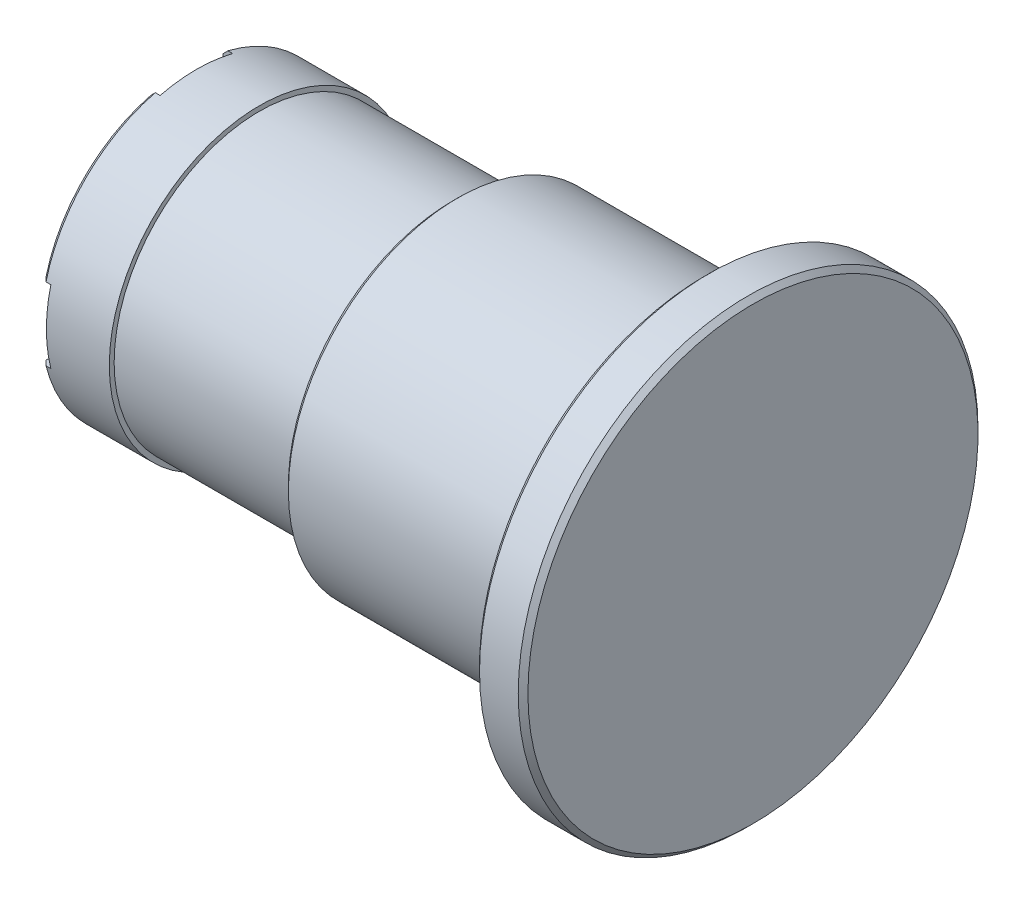
ISO-10303-21;
HEADER;
FILE_DESCRIPTION(('STEP AP214'),'2;1');
FILE_NAME('part.step','',(''),(''),'','','');
FILE_SCHEMA(('AUTOMOTIVE_DESIGN { 1 0 10303 214 1 1 1 1 }'));
ENDSEC;
DATA;
#1=APPLICATION_CONTEXT('core data for automotive mechanical design processes');
#2=APPLICATION_PROTOCOL_DEFINITION('international standard','automotive_design',2000,#1);
#3=PRODUCT_CONTEXT('',#1,'mechanical');
#4=PRODUCT('Part','Part','',(#3));
#5=PRODUCT_RELATED_PRODUCT_CATEGORY('part','',(#4));
#6=PRODUCT_DEFINITION_FORMATION('','',#4);
#7=PRODUCT_DEFINITION_CONTEXT('part definition',#1,'design');
#8=PRODUCT_DEFINITION('design','',#6,#7);
#9=PRODUCT_DEFINITION_SHAPE('','',#8);
#10=(LENGTH_UNIT() NAMED_UNIT(*) SI_UNIT(.MILLI.,.METRE.));
#11=(NAMED_UNIT(*) PLANE_ANGLE_UNIT() SI_UNIT($,.RADIAN.));
#12=(NAMED_UNIT(*) SI_UNIT($,.STERADIAN.) SOLID_ANGLE_UNIT());
#13=UNCERTAINTY_MEASURE_WITH_UNIT(LENGTH_MEASURE(1.E-05),#10,'distance_accuracy_value','');
#14=(GEOMETRIC_REPRESENTATION_CONTEXT(3) GLOBAL_UNCERTAINTY_ASSIGNED_CONTEXT((#13)) GLOBAL_UNIT_ASSIGNED_CONTEXT((#10,
#11,#12)) REPRESENTATION_CONTEXT('',''));
#15=CARTESIAN_POINT('',(0.,0.,0.));
#16=DIRECTION('',(0.,0.,1.));
#17=DIRECTION('',(1.,0.,0.));
#18=AXIS2_PLACEMENT_3D('',#15,#16,#17);
#19=CARTESIAN_POINT('',(10.,3.1,0.));
#20=DIRECTION('',(1.,0.,0.));
#21=DIRECTION('',(0.,0.,-1.));
#22=AXIS2_PLACEMENT_3D('',#19,#20,#21);
#23=PLANE('',#22);
#24=CARTESIAN_POINT('',(10.,0.,0.));
#25=DIRECTION('',(1.,0.,0.));
#26=DIRECTION('',(0.,0.,-1.));
#27=AXIS2_PLACEMENT_3D('',#24,#25,#26);
#28=CIRCLE('',#27,3.);
#29=CARTESIAN_POINT('',(10.,-2.90473750965556,0.750000000000001));
#30=VERTEX_POINT('',#29);
#31=CARTESIAN_POINT('',(10.,-0.75,2.90473750965556));
#32=VERTEX_POINT('',#31);
#33=EDGE_CURVE('E264',#30,#32,#28,.F.);
#34=ORIENTED_EDGE('',*,*,#33,.T.);
#35=DIRECTION('',(0.,0.,1.));
#36=VECTOR('',#35,1.);
#37=CARTESIAN_POINT('',(10.,-0.75,3.1));
#38=LINE('',#37,#36);
#39=CARTESIAN_POINT('',(10.,-0.749999999999999,0.750000000000004));
#40=VERTEX_POINT('',#39);
#41=EDGE_CURVE('E181',#40,#32,#38,.T.);
#42=ORIENTED_EDGE('',*,*,#41,.F.);
#43=DIRECTION('',(0.,1.,0.));
#44=VECTOR('',#43,1.);
#45=CARTESIAN_POINT('',(10.,-3.1,0.75));
#46=LINE('',#45,#44);
#47=EDGE_CURVE('E179',#30,#40,#46,.T.);
#48=ORIENTED_EDGE('',*,*,#47,.F.);
#49=EDGE_LOOP('',(#34,#42,#48));
#50=FACE_BOUND('',#49,.T.);
#51=ADVANCED_FACE('F33',(#50),#23,.F.);
#52=CARTESIAN_POINT('',(10.,-0.750000000000001,-2.90473750965556));
#53=VERTEX_POINT('',#52);
#54=CARTESIAN_POINT('',(10.,-2.90473750965556,-0.75));
#55=VERTEX_POINT('',#54);
#56=EDGE_CURVE('E260',#53,#55,#28,.F.);
#57=ORIENTED_EDGE('',*,*,#56,.T.);
#58=DIRECTION('',(0.,-1.,0.));
#59=VECTOR('',#58,1.);
#60=CARTESIAN_POINT('',(10.,-3.1,-0.75));
#61=LINE('',#60,#59);
#62=CARTESIAN_POINT('',(10.,-0.749999999999999,-0.750000000000004));
#63=VERTEX_POINT('',#62);
#64=EDGE_CURVE('E177',#63,#55,#61,.T.);
#65=ORIENTED_EDGE('',*,*,#64,.F.);
#66=DIRECTION('',(0.,0.,1.));
#67=VECTOR('',#66,1.);
#68=CARTESIAN_POINT('',(10.,-0.750000000000001,-3.1));
#69=LINE('',#68,#67);
#70=EDGE_CURVE('E175',#53,#63,#69,.T.);
#71=ORIENTED_EDGE('',*,*,#70,.F.);
#72=EDGE_LOOP('',(#57,#65,#71));
#73=FACE_BOUND('',#72,.T.);
#74=ADVANCED_FACE('F366',(#73),#23,.F.);
#75=CARTESIAN_POINT('',(10.,2.90473750965556,-0.750000000000001));
#76=VERTEX_POINT('',#75);
#77=CARTESIAN_POINT('',(10.,0.749999999999999,-2.90473750965556));
#78=VERTEX_POINT('',#77);
#79=EDGE_CURVE('E259',#76,#78,#28,.F.);
#80=ORIENTED_EDGE('',*,*,#79,.T.);
#81=DIRECTION('',(0.,0.,-1.));
#82=VECTOR('',#81,1.);
#83=CARTESIAN_POINT('',(10.,0.749999999999999,-3.1));
#84=LINE('',#83,#82);
#85=CARTESIAN_POINT('',(10.,0.749999999999997,-0.750000000000004));
#86=VERTEX_POINT('',#85);
#87=EDGE_CURVE('E171',#86,#78,#84,.T.);
#88=ORIENTED_EDGE('',*,*,#87,.F.);
#89=DIRECTION('',(0.,-1.,0.));
#90=VECTOR('',#89,1.);
#91=CARTESIAN_POINT('',(10.,3.1,-0.750000000000001));
#92=LINE('',#91,#90);
#93=EDGE_CURVE('E169',#76,#86,#92,.T.);
#94=ORIENTED_EDGE('',*,*,#93,.F.);
#95=EDGE_LOOP('',(#80,#88,#94));
#96=FACE_BOUND('',#95,.T.);
#97=ADVANCED_FACE('F368',(#96),#23,.F.);
#98=CARTESIAN_POINT('',(10.,0.,0.));
#99=DIRECTION('',(1.,0.,0.));
#100=DIRECTION('',(0.,0.,-1.));
#101=AXIS2_PLACEMENT_3D('',#98,#99,#100);
#102=CONICAL_SURFACE('',#101,3.,0.78539816339745);
#103=CARTESIAN_POINT('',(8.48797349994837,-0.749999999999999,1.28513234203663));
#104=CARTESIAN_POINT('',(8.53550991689547,-0.749999999999999,1.34014348841759));
#105=CARTESIAN_POINT('',(8.58345940381406,-0.749999999999999,1.39479345810989));
#106=CARTESIAN_POINT('',(8.68000414515661,-0.749999999999999,1.50351541700079));
#107=CARTESIAN_POINT('',(8.72859936521378,-0.749999999999999,1.55758743668448));
#108=CARTESIAN_POINT('',(8.82625437604512,-0.749999999999999,1.66529715996786));
#109=CARTESIAN_POINT('',(8.87531410995945,-0.749999999999999,1.7189349152709));
#110=CARTESIAN_POINT('',(8.97379947610258,-0.749999999999999,1.82587472681326));
#111=CARTESIAN_POINT('',(9.02322511391354,-0.75,1.87917677790809));
#112=CARTESIAN_POINT('',(9.1719057928897,-0.75,2.03866736831985));
#113=CARTESIAN_POINT('',(9.27158379133193,-0.75,2.1444613749807));
#114=CARTESIAN_POINT('',(9.47166652024134,-0.75,2.35536345735484));
#115=CARTESIAN_POINT('',(9.572071270384,-0.75,2.46047151434969));
#116=CARTESIAN_POINT('',(9.72297510197972,-0.75,2.61769122959809));
#117=CARTESIAN_POINT('',(9.77328636439209,-0.75,2.66998334595732));
#118=CARTESIAN_POINT('',(9.87401665237381,-0.75,2.7744662464874));
#119=CARTESIAN_POINT('',(9.92443568064932,-0.75,2.82665702804925));
#120=CARTESIAN_POINT('',(10.1768972105323,-0.75,3.0875517270652));
#121=CARTESIAN_POINT('',(10.37959707027,-0.75,3.29561940279909));
#122=CARTESIAN_POINT('',(10.7857779730739,-0.75,3.71099172618916));
#123=CARTESIAN_POINT('',(10.9892590213616,-0.750000000000001,3.91829636872697));
#124=CARTESIAN_POINT('',(11.3966682810608,-0.750000000000001,4.33238704032075));
#125=CARTESIAN_POINT('',(11.6005963987358,-0.750000000000001,4.53917316162607));
#126=CARTESIAN_POINT('',(12.0087838251524,-0.750000000000001,4.95241196908574));
#127=CARTESIAN_POINT('',(12.2130431286741,-0.750000000000001,5.15886466039514));
#128=CARTESIAN_POINT('',(12.4173936887703,-0.750000000000001,5.36522640520676));
#129=B_SPLINE_CURVE_WITH_KNOTS('',3,(#103,#104,#105,#106,#107,#108,#109,#110,#111,#112,#113,
#114,#115,#116,#117,#118,#119,#120,#121,#122,#123,#124,#125,#126,#127,#128),.UNSPECIFIED.,.F.,
.F.,(4,2,2,2,2,2,2,2,2,2,2,2,4),(0.,0.21810669376271,0.436201825720256,0.654270597792777,
0.87234270356012,1.30840150760503,1.74447216162829,1.96216722026967,2.17986781133147,
3.05130697966197,3.92275198292071,4.79402903802116,5.66529249111152),.UNSPECIFIED.);
#130=CARTESIAN_POINT('',(10.1,-0.75,3.00790624853901));
#131=VERTEX_POINT('',#130);
#132=EDGE_CURVE('E57',#32,#131,#129,.T.);
#133=ORIENTED_EDGE('',*,*,#132,.F.);
#134=ORIENTED_EDGE('',*,*,#33,.F.);
#135=CARTESIAN_POINT('',(12.4173936872672,-5.36522640368906,0.749999999999996));
#136=CARTESIAN_POINT('',(12.2129986134104,-5.15881962657307,0.749999999999997));
#137=CARTESIAN_POINT('',(12.0086947857239,-4.95232192991737,0.749999999999997));
#138=CARTESIAN_POINT('',(11.6004242747887,-4.53899879578677,0.749999999999998));
#139=CARTESIAN_POINT('',(11.396457587278,-4.33217336252068,0.749999999999998));
#140=CARTESIAN_POINT('',(10.9890543686154,-3.91808789204081,0.749999999999999));
#141=CARTESIAN_POINT('',(10.7856177333976,-3.71082795724907,0.749999999999999));
#142=CARTESIAN_POINT('',(10.3795197448063,-3.29554022344002,0.75));
#143=CARTESIAN_POINT('',(10.1768584068401,-3.08751240932272,0.75));
#144=CARTESIAN_POINT('',(9.84858881974948,-2.74827610621001,0.750000000000001));
#145=CARTESIAN_POINT('',(9.72255352539098,-2.61748110940866,0.750000000000001));
#146=CARTESIAN_POINT('',(9.47133184590346,-2.35508817231464,0.750000000000001));
#147=CARTESIAN_POINT('',(9.34614541945728,-2.22349027170287,0.750000000000002));
#148=CARTESIAN_POINT('',(9.15940121536988,-2.0250936325742,0.750000000000002));
#149=CARTESIAN_POINT('',(9.09731973340823,-1.95878829190665,0.750000000000002));
#150=CARTESIAN_POINT('',(8.9736315384963,-1.82573866121868,0.750000000000002));
#151=CARTESIAN_POINT('',(8.91202481526404,-1.75899438076286,0.750000000000003));
#152=CARTESIAN_POINT('',(8.78943714677606,-1.62491174400759,0.750000000000003));
#153=CARTESIAN_POINT('',(8.72845630243173,-1.55757329506596,0.750000000000003));
#154=CARTESIAN_POINT('',(8.60743301308139,-1.42205042730365,0.750000000000003));
#155=CARTESIAN_POINT('',(8.54739063942093,-1.35386594486483,0.750000000000003));
#156=CARTESIAN_POINT('',(8.48797349377788,-1.28513233489221,0.750000000000003));
#157=B_SPLINE_CURVE_WITH_KNOTS('',3,(#135,#136,#137,#138,#139,#140,#141,#142,#143,#144,#145,
#146,#147,#148,#149,#150,#151,#152,#153,#154,#155,#156),.UNSPECIFIED.,.F.,.F.,(4,2,2,2,2,2,2,2,
2,2,4),(0.,0.871453388257607,1.74289567454069,2.61415156374938,3.48542467805791,
4.03033569507897,4.5752199963421,4.84771514777145,5.12020438101452,5.39273687891919,
5.66528999582681),.UNSPECIFIED.);
#158=CARTESIAN_POINT('',(10.1,-3.00790624853901,0.75));
#159=VERTEX_POINT('',#158);
#160=EDGE_CURVE('E335',#159,#30,#157,.T.);
#161=ORIENTED_EDGE('',*,*,#160,.F.);
#162=CARTESIAN_POINT('',(10.1,0.,0.));
#163=DIRECTION('',(1.,0.,0.));
#164=DIRECTION('',(0.,0.,-1.));
#165=AXIS2_PLACEMENT_3D('',#162,#163,#164);
#166=CIRCLE('',#165,3.1);
#167=EDGE_CURVE('E267',#131,#159,#166,.T.);
#168=ORIENTED_EDGE('',*,*,#167,.F.);
#169=EDGE_LOOP('',(#133,#134,#161,#168));
#170=FACE_BOUND('',#169,.T.);
#171=ADVANCED_FACE('F374',(#170),#102,.T.);
#172=CARTESIAN_POINT('',(8.48797349994839,-1.28513234203666,-0.750000000000003));
#173=CARTESIAN_POINT('',(8.5355099168955,-1.34014348841761,-0.750000000000003));
#174=CARTESIAN_POINT('',(8.58345940381409,-1.39479345810991,-0.750000000000003));
#175=CARTESIAN_POINT('',(8.68000414515663,-1.50351541700081,-0.750000000000003));
#176=CARTESIAN_POINT('',(8.7285993652138,-1.55758743668451,-0.750000000000003));
#177=CARTESIAN_POINT('',(8.82625437604515,-1.66529715996789,-0.750000000000002));
#178=CARTESIAN_POINT('',(8.87531410995948,-1.71893491527093,-0.750000000000002));
#179=CARTESIAN_POINT('',(8.97379947610261,-1.82587472681329,-0.750000000000002));
#180=CARTESIAN_POINT('',(9.02322511391357,-1.87917677790812,-0.750000000000002));
#181=CARTESIAN_POINT('',(9.17190579288973,-2.03866736831989,-0.750000000000002));
#182=CARTESIAN_POINT('',(9.27158379133196,-2.14446137498074,-0.750000000000002));
#183=CARTESIAN_POINT('',(9.47166652024138,-2.35536345735488,-0.750000000000001));
#184=CARTESIAN_POINT('',(9.57207127038404,-2.46047151434974,-0.750000000000001));
#185=CARTESIAN_POINT('',(9.72297510197975,-2.61769122959813,-0.750000000000001));
#186=CARTESIAN_POINT('',(9.77328636439212,-2.66998334595735,-0.750000000000001));
#187=CARTESIAN_POINT('',(9.87401665237382,-2.77446624648741,-0.75));
#188=CARTESIAN_POINT('',(9.92443568064932,-2.82665702804926,-0.75));
#189=CARTESIAN_POINT('',(10.1768972105323,-3.0875517270652,-0.75));
#190=CARTESIAN_POINT('',(10.37959707027,-3.2956194027991,-0.749999999999999));
#191=CARTESIAN_POINT('',(10.7857779730739,-3.71099172618916,-0.749999999999999));
#192=CARTESIAN_POINT('',(10.9892590213616,-3.91829636872697,-0.749999999999998));
#193=CARTESIAN_POINT('',(11.3966682810608,-4.33238704032076,-0.749999999999998));
#194=CARTESIAN_POINT('',(11.6005963987358,-4.53917316162607,-0.749999999999997));
#195=CARTESIAN_POINT('',(12.0087838251524,-4.95241196908574,-0.749999999999996));
#196=CARTESIAN_POINT('',(12.213043128674,-5.15886466039514,-0.749999999999996));
#197=CARTESIAN_POINT('',(12.4173936887703,-5.36522640520676,-0.749999999999996));
#198=B_SPLINE_CURVE_WITH_KNOTS('',3,(#172,#173,#174,#175,#176,#177,#178,#179,#180,#181,#182,
#183,#184,#185,#186,#187,#188,#189,#190,#191,#192,#193,#194,#195,#196,#197),.UNSPECIFIED.,.F.,
.F.,(4,2,2,2,2,2,2,2,2,2,2,2,4),(0.,0.218106693762713,0.436201825720263,0.654270597792788,
0.872342703560135,1.30840150760505,1.74447216162832,1.96216722026966,2.17986781133143,
3.05130697966194,3.92275198292069,4.79402903802113,5.66529249111149),.UNSPECIFIED.);
#199=CARTESIAN_POINT('',(10.1,-3.00790624853901,-0.75));
#200=VERTEX_POINT('',#199);
#201=EDGE_CURVE('E312',#55,#200,#198,.T.);
#202=ORIENTED_EDGE('',*,*,#201,.F.);
#203=ORIENTED_EDGE('',*,*,#56,.F.);
#204=CARTESIAN_POINT('',(12.4173936872672,-0.750000000000003,-5.36522640368906));
#205=CARTESIAN_POINT('',(12.2129986134104,-0.750000000000003,-5.15881962657307));
#206=CARTESIAN_POINT('',(12.0086947857239,-0.750000000000003,-4.95232192991737));
#207=CARTESIAN_POINT('',(11.6004242747887,-0.750000000000002,-4.53899879578677));
#208=CARTESIAN_POINT('',(11.396457587278,-0.750000000000002,-4.33217336252069));
#209=CARTESIAN_POINT('',(10.9890543686154,-0.750000000000002,-3.91808789204081));
#210=CARTESIAN_POINT('',(10.7856177333976,-0.750000000000001,-3.71082795724907));
#211=CARTESIAN_POINT('',(10.3795197448063,-0.750000000000001,-3.29554022344002));
#212=CARTESIAN_POINT('',(10.1768584068401,-0.750000000000001,-3.08751240932272));
#213=CARTESIAN_POINT('',(9.84858881974948,-0.750000000000001,-2.74827610621001));
#214=CARTESIAN_POINT('',(9.72255352539098,-0.75,-2.61748110940865));
#215=CARTESIAN_POINT('',(9.47133184590345,-0.75,-2.35508817231463));
#216=CARTESIAN_POINT('',(9.34614541945727,-0.75,-2.22349027170286));
#217=CARTESIAN_POINT('',(9.15940121536986,-0.75,-2.02509363257419));
#218=CARTESIAN_POINT('',(9.09731973340821,-0.75,-1.95878829190664));
#219=CARTESIAN_POINT('',(8.97363153849629,-0.75,-1.82573866121867));
#220=CARTESIAN_POINT('',(8.91202481526403,-0.75,-1.75899438076284));
#221=CARTESIAN_POINT('',(8.78943714677603,-0.75,-1.62491174400757));
#222=CARTESIAN_POINT('',(8.72845630243171,-0.75,-1.55757329506594));
#223=CARTESIAN_POINT('',(8.60743301308136,-0.75,-1.42205042730362));
#224=CARTESIAN_POINT('',(8.54739063942091,-0.749999999999999,-1.3538659448648));
#225=CARTESIAN_POINT('',(8.48797349377786,-0.749999999999999,-1.28513233489218));
#226=B_SPLINE_CURVE_WITH_KNOTS('',3,(#204,#205,#206,#207,#208,#209,#210,#211,#212,#213,#214,
#215,#216,#217,#218,#219,#220,#221,#222,#223,#224,#225),.UNSPECIFIED.,.F.,.F.,(4,2,2,2,2,2,2,2,
2,2,4),(0.,0.871453388257607,1.74289567454069,2.61415156374938,3.48542467805791,
4.03033569507898,4.57521999634212,4.84771514777148,5.12020438101455,5.39273687891922,
5.66528999582685),.UNSPECIFIED.);
#227=CARTESIAN_POINT('',(10.1,-0.750000000000001,-3.00790624853901));
#228=VERTEX_POINT('',#227);
#229=EDGE_CURVE('E307',#228,#53,#226,.T.);
#230=ORIENTED_EDGE('',*,*,#229,.F.);
#231=EDGE_CURVE('E263',#200,#228,#166,.T.);
#232=ORIENTED_EDGE('',*,*,#231,.F.);
#233=EDGE_LOOP('',(#202,#203,#230,#232));
#234=FACE_BOUND('',#233,.T.);
#235=ADVANCED_FACE('F361',(#234),#102,.T.);
#236=CARTESIAN_POINT('',(8.48797349377785,0.749999999999998,-1.28513233489218));
#237=CARTESIAN_POINT('',(8.53550991049043,0.749999999999998,-1.34014348107913));
#238=CARTESIAN_POINT('',(8.58345939717719,0.749999999999998,-1.39479345057553));
#239=CARTESIAN_POINT('',(8.68000413806016,0.749999999999998,-1.50351540907158));
#240=CARTESIAN_POINT('',(8.72859935788958,0.749999999999998,-1.55758742855632));
#241=CARTESIAN_POINT('',(8.82625436826821,0.749999999999998,-1.66529715143945));
#242=CARTESIAN_POINT('',(8.87531410195758,0.749999999999998,-1.71893490654119));
#243=CARTESIAN_POINT('',(8.97379946765297,0.749999999999998,-1.82587471767921));
#244=CARTESIAN_POINT('',(9.02322510524115,0.749999999999998,-1.87917676857101));
#245=CARTESIAN_POINT('',(9.1719057835511,0.749999999999998,-2.03866735837126));
#246=CARTESIAN_POINT('',(9.27158378155234,0.749999999999998,-2.1444613646216));
#247=CARTESIAN_POINT('',(9.47166650958386,0.749999999999998,-2.35536344617129));
#248=CARTESIAN_POINT('',(9.5720712592896,0.749999999999999,-2.46047150275222));
#249=CARTESIAN_POINT('',(9.72297509236291,0.749999999999999,-2.61769121959801));
#250=CARTESIAN_POINT('',(9.77328635669407,0.749999999999999,-2.66998333796439));
#251=CARTESIAN_POINT('',(9.87401664852227,0.749999999999999,-2.77446624250045));
#252=CARTESIAN_POINT('',(9.92443567872547,0.749999999999999,-2.82665702606113));
#253=CARTESIAN_POINT('',(10.1768972104156,0.749999999999999,-3.08755172694474));
#254=CARTESIAN_POINT('',(10.3795970700288,0.749999999999999,-3.29561940255142));
#255=CARTESIAN_POINT('',(10.7857779725827,0.75,-3.71099172568778));
#256=CARTESIAN_POINT('',(10.989259020745,0.75,-3.9182963680991));
#257=CARTESIAN_POINT('',(11.3966682801922,0.75,-4.33238703943906));
#258=CARTESIAN_POINT('',(11.6005963977403,0.75,-4.53917316061706));
#259=CARTESIAN_POINT('',(12.0087838239032,0.750000000000001,-4.95241196782227));
#260=CARTESIAN_POINT('',(12.2130431272979,0.750000000000001,-5.15886465900455));
#261=CARTESIAN_POINT('',(12.4173936872672,0.750000000000001,-5.36522640368906));
#262=B_SPLINE_CURVE_WITH_KNOTS('',3,(#236,#237,#238,#239,#240,#241,#242,#243,#244,#245,#246,
#247,#248,#249,#250,#251,#252,#253,#254,#255,#256,#257,#258,#259,#260,#261),.UNSPECIFIED.,.F.,
.F.,(4,2,2,2,2,2,2,2,2,2,2,2,4),(0.,0.218106692862199,0.436201823919049,0.65427059509043,
0.87234269995669,1.30840150219795,1.74447215441784,1.96216722138944,2.179867820782,
3.05130698857831,3.92275199130283,4.79402904586425,5.66529249841564),.UNSPECIFIED.);
#263=CARTESIAN_POINT('',(10.1,0.749999999999999,-3.00790624853901));
#264=VERTEX_POINT('',#263);
#265=EDGE_CURVE('E302',#78,#264,#262,.T.);
#266=ORIENTED_EDGE('',*,*,#265,.F.);
#267=ORIENTED_EDGE('',*,*,#79,.F.);
#268=CARTESIAN_POINT('',(12.4173936872672,5.36522640368906,-0.749999999999997));
#269=CARTESIAN_POINT('',(12.2129986134104,5.15881962657307,-0.749999999999997));
#270=CARTESIAN_POINT('',(12.0086947857239,4.95232192991737,-0.749999999999998));
#271=CARTESIAN_POINT('',(11.6004242747887,4.53899879578677,-0.749999999999998));
#272=CARTESIAN_POINT('',(11.396457587278,4.33217336252069,-0.749999999999999));
#273=CARTESIAN_POINT('',(10.9890543686154,3.91808789204081,-0.749999999999999));
#274=CARTESIAN_POINT('',(10.7856177333976,3.71082795724907,-0.75));
#275=CARTESIAN_POINT('',(10.3795197448063,3.29554022344002,-0.75));
#276=CARTESIAN_POINT('',(10.1768584068401,3.08751240932272,-0.750000000000001));
#277=CARTESIAN_POINT('',(9.84858881974948,2.74827610621001,-0.750000000000001));
#278=CARTESIAN_POINT('',(9.72255352539098,2.61748110940866,-0.750000000000001));
#279=CARTESIAN_POINT('',(9.47133184590346,2.35508817231464,-0.750000000000002));
#280=CARTESIAN_POINT('',(9.34614541945728,2.22349027170288,-0.750000000000002));
#281=CARTESIAN_POINT('',(9.15940121536988,2.02509363257421,-0.750000000000002));
#282=CARTESIAN_POINT('',(9.09731973340823,1.95878829190666,-0.750000000000002));
#283=CARTESIAN_POINT('',(8.9736315384963,1.82573866121869,-0.750000000000003));
#284=CARTESIAN_POINT('',(8.91202481526405,1.75899438076286,-0.750000000000003));
#285=CARTESIAN_POINT('',(8.78943714677606,1.62491174400759,-0.750000000000003));
#286=CARTESIAN_POINT('',(8.72845630243174,1.55757329506596,-0.750000000000003));
#287=CARTESIAN_POINT('',(8.60743301308139,1.42205042730365,-0.750000000000003));
#288=CARTESIAN_POINT('',(8.54739063942093,1.35386594486483,-0.750000000000003));
#289=CARTESIAN_POINT('',(8.48797349377788,1.28513233489221,-0.750000000000003));
#290=B_SPLINE_CURVE_WITH_KNOTS('',3,(#268,#269,#270,#271,#272,#273,#274,#275,#276,#277,#278,
#279,#280,#281,#282,#283,#284,#285,#286,#287,#288,#289),.UNSPECIFIED.,.F.,.F.,(4,2,2,2,2,2,2,2,
2,2,4),(0.,0.871453388257606,1.74289567454069,2.61415156374938,3.48542467805791,
4.03033569507897,4.5752199963421,4.84771514777145,5.12020438101452,5.39273687891919,
5.66528999582681),.UNSPECIFIED.);
#291=CARTESIAN_POINT('',(10.1,3.00790624853901,-0.750000000000001));
#292=VERTEX_POINT('',#291);
#293=EDGE_CURVE('E297',#292,#76,#290,.T.);
#294=ORIENTED_EDGE('',*,*,#293,.F.);
#295=EDGE_CURVE('E268',#264,#292,#166,.T.);
#296=ORIENTED_EDGE('',*,*,#295,.F.);
#297=EDGE_LOOP('',(#266,#267,#294,#296));
#298=FACE_BOUND('',#297,.T.);
#299=ADVANCED_FACE('F390',(#298),#102,.T.);
#300=CARTESIAN_POINT('',(20.7,4.75,0.));
#301=DIRECTION('',(1.,0.,0.));
#302=DIRECTION('',(0.,0.,-1.));
#303=AXIS2_PLACEMENT_3D('',#300,#301,#302);
#304=PLANE('',#303);
#305=CARTESIAN_POINT('',(20.7,0.,0.));
#306=DIRECTION('',(1.,0.,0.));
#307=DIRECTION('',(0.,0.,-1.));
#308=AXIS2_PLACEMENT_3D('',#305,#306,#307);
#309=CIRCLE('',#308,4.65);
#310=CARTESIAN_POINT('',(20.7,0.,-4.65));
#311=VERTEX_POINT('',#310);
#312=EDGE_CURVE('E250',#311,#311,#309,.F.);
#313=ORIENTED_EDGE('',*,*,#312,.T.);
#314=EDGE_LOOP('',(#313));
#315=FACE_BOUND('',#314,.T.);
#316=CARTESIAN_POINT('',(20.7,0.,0.));
#317=DIRECTION('',(-1.,0.,0.));
#318=DIRECTION('',(0.,0.,1.));
#319=AXIS2_PLACEMENT_3D('',#316,#317,#318);
#320=CIRCLE('',#319,3.49999999999999);
#321=CARTESIAN_POINT('',(20.7,0.,3.49999999999999));
#322=VERTEX_POINT('',#321);
#323=EDGE_CURVE('E229',#322,#322,#320,.T.);
#324=ORIENTED_EDGE('',*,*,#323,.F.);
#325=EDGE_LOOP('',(#324));
#326=FACE_BOUND('',#325,.T.);
#327=ADVANCED_FACE('F35',(#315,#326),#304,.F.);
#328=CARTESIAN_POINT('',(0.,0.,0.));
#329=DIRECTION('',(-1.,0.,0.));
#330=DIRECTION('',(0.,0.,1.));
#331=AXIS2_PLACEMENT_3D('',#328,#329,#330);
#332=CYLINDRICAL_SURFACE('',#331,4.75);
#333=CARTESIAN_POINT('',(21.6,0.,0.));
#334=DIRECTION('',(-1.,0.,0.));
#335=DIRECTION('',(0.,0.,1.));
#336=AXIS2_PLACEMENT_3D('',#333,#334,#335);
#337=CIRCLE('',#336,4.75);
#338=CARTESIAN_POINT('',(21.6,0.,4.75));
#339=VERTEX_POINT('',#338);
#340=EDGE_CURVE('E244',#339,#339,#337,.T.);
#341=ORIENTED_EDGE('',*,*,#340,.T.);
#342=EDGE_LOOP('',(#341));
#343=FACE_BOUND('',#342,.T.);
#344=CARTESIAN_POINT('',(20.8,0.,0.));
#345=DIRECTION('',(1.,0.,0.));
#346=DIRECTION('',(0.,0.,-1.));
#347=AXIS2_PLACEMENT_3D('',#344,#345,#346);
#348=CIRCLE('',#347,4.75);
#349=CARTESIAN_POINT('',(20.8,0.,-4.75));
#350=VERTEX_POINT('',#349);
#351=EDGE_CURVE('E241',#350,#350,#348,.T.);
#352=ORIENTED_EDGE('',*,*,#351,.T.);
#353=EDGE_LOOP('',(#352));
#354=FACE_BOUND('',#353,.T.);
#355=ADVANCED_FACE('F383',(#343,#354),#332,.T.);
#356=CARTESIAN_POINT('',(21.7,4.75,0.));
#357=DIRECTION('',(-1.,0.,0.));
#358=DIRECTION('',(0.,0.,1.));
#359=AXIS2_PLACEMENT_3D('',#356,#357,#358);
#360=PLANE('',#359);
#361=CARTESIAN_POINT('',(21.7,0.,0.));
#362=DIRECTION('',(-1.,0.,0.));
#363=DIRECTION('',(0.,0.,1.));
#364=AXIS2_PLACEMENT_3D('',#361,#362,#363);
#365=CIRCLE('',#364,4.65);
#366=CARTESIAN_POINT('',(21.7,0.,4.65));
#367=VERTEX_POINT('',#366);
#368=EDGE_CURVE('E247',#367,#367,#365,.F.);
#369=ORIENTED_EDGE('',*,*,#368,.T.);
#370=EDGE_LOOP('',(#369));
#371=FACE_BOUND('',#370,.T.);
#372=ADVANCED_FACE('F380',(#371),#360,.F.);
#373=CARTESIAN_POINT('',(10.,0.75,2.90473750965556));
#374=VERTEX_POINT('',#373);
#375=CARTESIAN_POINT('',(10.,2.90473750965556,0.75));
#376=VERTEX_POINT('',#375);
#377=EDGE_CURVE('E168',#374,#376,#28,.F.);
#378=ORIENTED_EDGE('',*,*,#377,.T.);
#379=DIRECTION('',(0.,1.,0.));
#380=VECTOR('',#379,1.);
#381=CARTESIAN_POINT('',(10.,3.1,0.749999999999999));
#382=LINE('',#381,#380);
#383=CARTESIAN_POINT('',(10.,0.749999999999999,0.750000000000004));
#384=VERTEX_POINT('',#383);
#385=EDGE_CURVE('E156',#384,#376,#382,.T.);
#386=ORIENTED_EDGE('',*,*,#385,.F.);
#387=DIRECTION('',(0.,0.,-1.));
#388=VECTOR('',#387,1.);
#389=CARTESIAN_POINT('',(10.,0.75,3.1));
#390=LINE('',#389,#388);
#391=EDGE_CURVE('E146',#374,#384,#390,.T.);
#392=ORIENTED_EDGE('',*,*,#391,.F.);
#393=EDGE_LOOP('',(#378,#386,#392));
#394=FACE_BOUND('',#393,.T.);
#395=ADVANCED_FACE('F167',(#394),#23,.F.);
#396=CARTESIAN_POINT('',(0.,0.,0.));
#397=DIRECTION('',(-1.,0.,0.));
#398=DIRECTION('',(0.,0.,1.));
#399=AXIS2_PLACEMENT_3D('',#396,#397,#398);
#400=CYLINDRICAL_SURFACE('',#399,3.1);
#401=ORIENTED_EDGE('',*,*,#295,.T.);
#402=DIRECTION('',(-1.,0.,0.));
#403=VECTOR('',#402,1.);
#404=CARTESIAN_POINT('',(0.,3.00790624853901,-0.750000000000001));
#405=LINE('',#404,#403);
#406=CARTESIAN_POINT('',(10.2,3.00790624853901,-0.750000000000001));
#407=VERTEX_POINT('',#406);
#408=EDGE_CURVE('E212',#292,#407,#405,.F.);
#409=ORIENTED_EDGE('',*,*,#408,.T.);
#410=CARTESIAN_POINT('',(10.2,0.,0.));
#411=DIRECTION('',(-1.,0.,0.));
#412=DIRECTION('',(0.,0.,1.));
#413=AXIS2_PLACEMENT_3D('',#410,#411,#412);
#414=CIRCLE('',#413,3.1);
#415=CARTESIAN_POINT('',(10.2,3.00790624853901,0.75));
#416=VERTEX_POINT('',#415);
#417=EDGE_CURVE('E11',#416,#407,#414,.T.);
#418=ORIENTED_EDGE('',*,*,#417,.F.);
#419=DIRECTION('',(-1.,0.,0.));
#420=VECTOR('',#419,1.);
#421=CARTESIAN_POINT('',(0.,3.00790624853901,0.75));
#422=LINE('',#421,#420);
#423=CARTESIAN_POINT('',(10.1,3.00790624853901,0.75));
#424=VERTEX_POINT('',#423);
#425=EDGE_CURVE('E209',#416,#424,#422,.T.);
#426=ORIENTED_EDGE('',*,*,#425,.T.);
#427=CARTESIAN_POINT('',(10.1,0.75,3.00790624853901));
#428=VERTEX_POINT('',#427);
#429=EDGE_CURVE('E613',#424,#428,#166,.T.);
#430=ORIENTED_EDGE('',*,*,#429,.T.);
#431=DIRECTION('',(-1.,0.,0.));
#432=VECTOR('',#431,1.);
#433=CARTESIAN_POINT('',(0.,0.75,3.00790624853901));
#434=LINE('',#433,#432);
#435=CARTESIAN_POINT('',(10.2,0.75,3.00790624853901));
#436=VERTEX_POINT('',#435);
#437=EDGE_CURVE('E49',#428,#436,#434,.F.);
#438=ORIENTED_EDGE('',*,*,#437,.T.);
#439=CARTESIAN_POINT('',(10.2,-0.75,3.00790624853901));
#440=VERTEX_POINT('',#439);
#441=EDGE_CURVE('E37',#440,#436,#414,.T.);
#442=ORIENTED_EDGE('',*,*,#441,.F.);
#443=DIRECTION('',(-1.,0.,0.));
#444=VECTOR('',#443,1.);
#445=CARTESIAN_POINT('',(0.,-0.75,3.00790624853901));
#446=LINE('',#445,#444);
#447=EDGE_CURVE('E227',#440,#131,#446,.T.);
#448=ORIENTED_EDGE('',*,*,#447,.T.);
#449=ORIENTED_EDGE('',*,*,#167,.T.);
#450=DIRECTION('',(-1.,0.,0.));
#451=VECTOR('',#450,1.);
#452=CARTESIAN_POINT('',(0.,-3.00790624853901,0.75));
#453=LINE('',#452,#451);
#454=CARTESIAN_POINT('',(10.2,-3.00790624853901,0.75));
#455=VERTEX_POINT('',#454);
#456=EDGE_CURVE('E224',#159,#455,#453,.F.);
#457=ORIENTED_EDGE('',*,*,#456,.T.);
#458=CARTESIAN_POINT('',(10.2,-3.00790624853901,-0.75));
#459=VERTEX_POINT('',#458);
#460=EDGE_CURVE('E342',#459,#455,#414,.T.);
#461=ORIENTED_EDGE('',*,*,#460,.F.);
#462=DIRECTION('',(-1.,0.,0.));
#463=VECTOR('',#462,1.);
#464=CARTESIAN_POINT('',(0.,-3.00790624853901,-0.75));
#465=LINE('',#464,#463);
#466=EDGE_CURVE('E221',#459,#200,#465,.T.);
#467=ORIENTED_EDGE('',*,*,#466,.T.);
#468=ORIENTED_EDGE('',*,*,#231,.T.);
#469=DIRECTION('',(-1.,0.,0.));
#470=VECTOR('',#469,1.);
#471=CARTESIAN_POINT('',(0.,-0.750000000000001,-3.00790624853901));
#472=LINE('',#471,#470);
#473=CARTESIAN_POINT('',(10.2,-0.750000000000001,-3.00790624853901));
#474=VERTEX_POINT('',#473);
#475=EDGE_CURVE('E218',#228,#474,#472,.F.);
#476=ORIENTED_EDGE('',*,*,#475,.T.);
#477=CARTESIAN_POINT('',(10.2,0.749999999999999,-3.00790624853901));
#478=VERTEX_POINT('',#477);
#479=EDGE_CURVE('E42',#478,#474,#414,.T.);
#480=ORIENTED_EDGE('',*,*,#479,.F.);
#481=DIRECTION('',(-1.,0.,0.));
#482=VECTOR('',#481,1.);
#483=CARTESIAN_POINT('',(0.,0.749999999999999,-3.00790624853901));
#484=LINE('',#483,#482);
#485=EDGE_CURVE('E215',#478,#264,#484,.T.);
#486=ORIENTED_EDGE('',*,*,#485,.T.);
#487=EDGE_LOOP('',(#401,#409,#418,#426,#430,#438,#442,#448,#449,#457,#461,#467,#468,#476,#480,#486));
#488=FACE_BOUND('',#487,.T.);
#489=CARTESIAN_POINT('',(11.5,0.,0.));
#490=DIRECTION('',(-1.,0.,0.));
#491=DIRECTION('',(0.,0.,1.));
#492=AXIS2_PLACEMENT_3D('',#489,#490,#491);
#493=CIRCLE('',#492,3.1);
#494=CARTESIAN_POINT('',(11.5,0.,3.1));
#495=VERTEX_POINT('',#494);
#496=EDGE_CURVE('E238',#495,#495,#493,.T.);
#497=ORIENTED_EDGE('',*,*,#496,.T.);
#498=EDGE_LOOP('',(#497));
#499=FACE_BOUND('',#498,.T.);
#500=ADVANCED_FACE('F355',(#488,#499),#400,.T.);
#501=CARTESIAN_POINT('',(11.5,3.,0.));
#502=DIRECTION('',(-1.,0.,0.));
#503=DIRECTION('',(0.,0.,1.));
#504=AXIS2_PLACEMENT_3D('',#501,#502,#503);
#505=PLANE('',#504);
#506=ORIENTED_EDGE('',*,*,#496,.F.);
#507=EDGE_LOOP('',(#506));
#508=FACE_BOUND('',#507,.T.);
#509=CARTESIAN_POINT('',(11.5,0.,0.));
#510=DIRECTION('',(-1.,0.,0.));
#511=DIRECTION('',(0.,0.,1.));
#512=AXIS2_PLACEMENT_3D('',#509,#510,#511);
#513=CIRCLE('',#512,3.);
#514=CARTESIAN_POINT('',(11.5,0.,3.));
#515=VERTEX_POINT('',#514);
#516=EDGE_CURVE('E235',#515,#515,#513,.T.);
#517=ORIENTED_EDGE('',*,*,#516,.T.);
#518=EDGE_LOOP('',(#517));
#519=FACE_BOUND('',#518,.T.);
#520=ADVANCED_FACE('F422',(#508,#519),#505,.F.);
#521=CARTESIAN_POINT('',(0.,0.,0.));
#522=DIRECTION('',(-1.,0.,0.));
#523=DIRECTION('',(0.,0.,1.));
#524=AXIS2_PLACEMENT_3D('',#521,#522,#523);
#525=CYLINDRICAL_SURFACE('',#524,3.);
#526=ORIENTED_EDGE('',*,*,#516,.F.);
#527=EDGE_LOOP('',(#526));
#528=FACE_BOUND('',#527,.T.);
#529=CARTESIAN_POINT('',(15.5,0.,0.));
#530=DIRECTION('',(-1.,0.,0.));
#531=DIRECTION('',(0.,0.,1.));
#532=AXIS2_PLACEMENT_3D('',#529,#530,#531);
#533=CIRCLE('',#532,3.);
#534=CARTESIAN_POINT('',(15.5,0.,3.));
#535=VERTEX_POINT('',#534);
#536=EDGE_CURVE('E232',#535,#535,#533,.T.);
#537=ORIENTED_EDGE('',*,*,#536,.T.);
#538=EDGE_LOOP('',(#537));
#539=FACE_BOUND('',#538,.T.);
#540=ADVANCED_FACE('F417',(#528,#539),#525,.T.);
#541=CARTESIAN_POINT('',(15.5,3.49999999999999,0.));
#542=DIRECTION('',(1.,0.,0.));
#543=DIRECTION('',(0.,0.,-1.));
#544=AXIS2_PLACEMENT_3D('',#541,#542,#543);
#545=PLANE('',#544);
#546=CARTESIAN_POINT('',(15.5,0.,0.));
#547=DIRECTION('',(1.,0.,0.));
#548=DIRECTION('',(0.,0.,-1.));
#549=AXIS2_PLACEMENT_3D('',#546,#547,#548);
#550=CIRCLE('',#549,3.39999999999999);
#551=CARTESIAN_POINT('',(15.5,0.,-3.39999999999999));
#552=VERTEX_POINT('',#551);
#553=EDGE_CURVE('E253',#552,#552,#550,.F.);
#554=ORIENTED_EDGE('',*,*,#553,.T.);
#555=EDGE_LOOP('',(#554));
#556=FACE_BOUND('',#555,.T.);
#557=ORIENTED_EDGE('',*,*,#536,.F.);
#558=EDGE_LOOP('',(#557));
#559=FACE_BOUND('',#558,.T.);
#560=ADVANCED_FACE('F408',(#556,#559),#545,.F.);
#561=CARTESIAN_POINT('',(0.,0.,0.));
#562=DIRECTION('',(-1.,0.,0.));
#563=DIRECTION('',(0.,0.,1.));
#564=AXIS2_PLACEMENT_3D('',#561,#562,#563);
#565=CYLINDRICAL_SURFACE('',#564,3.49999999999999);
#566=CARTESIAN_POINT('',(15.6,0.,0.));
#567=DIRECTION('',(1.,0.,0.));
#568=DIRECTION('',(0.,0.,-1.));
#569=AXIS2_PLACEMENT_3D('',#566,#567,#568);
#570=CIRCLE('',#569,3.49999999999999);
#571=CARTESIAN_POINT('',(15.6,0.,-3.49999999999999));
#572=VERTEX_POINT('',#571);
#573=EDGE_CURVE('E256',#572,#572,#570,.T.);
#574=ORIENTED_EDGE('',*,*,#573,.T.);
#575=EDGE_LOOP('',(#574));
#576=FACE_BOUND('',#575,.T.);
#577=ORIENTED_EDGE('',*,*,#323,.T.);
#578=EDGE_LOOP('',(#577));
#579=FACE_BOUND('',#578,.T.);
#580=ADVANCED_FACE('F406',(#576,#579),#565,.T.);
#581=CARTESIAN_POINT('',(21.6,0.,0.));
#582=DIRECTION('',(-1.,0.,0.));
#583=DIRECTION('',(0.,0.,1.));
#584=AXIS2_PLACEMENT_3D('',#581,#582,#583);
#585=CONICAL_SURFACE('',#584,4.75,0.78539816339744);
#586=ORIENTED_EDGE('',*,*,#368,.F.);
#587=EDGE_LOOP('',(#586));
#588=FACE_BOUND('',#587,.T.);
#589=ORIENTED_EDGE('',*,*,#340,.F.);
#590=EDGE_LOOP('',(#589));
#591=FACE_BOUND('',#590,.T.);
#592=ADVANCED_FACE('F400',(#588,#591),#585,.T.);
#593=CARTESIAN_POINT('',(20.7,0.,0.));
#594=DIRECTION('',(1.,0.,0.));
#595=DIRECTION('',(0.,0.,-1.));
#596=AXIS2_PLACEMENT_3D('',#593,#594,#595);
#597=CONICAL_SURFACE('',#596,4.65,0.785398163397461);
#598=ORIENTED_EDGE('',*,*,#351,.F.);
#599=EDGE_LOOP('',(#598));
#600=FACE_BOUND('',#599,.T.);
#601=ORIENTED_EDGE('',*,*,#312,.F.);
#602=EDGE_LOOP('',(#601));
#603=FACE_BOUND('',#602,.T.);
#604=ADVANCED_FACE('F396',(#600,#603),#597,.T.);
#605=CARTESIAN_POINT('',(15.5,0.,0.));
#606=DIRECTION('',(1.,0.,0.));
#607=DIRECTION('',(0.,0.,-1.));
#608=AXIS2_PLACEMENT_3D('',#605,#606,#607);
#609=CONICAL_SURFACE('',#608,3.39999999999999,0.78539816339745);
#610=ORIENTED_EDGE('',*,*,#573,.F.);
#611=EDGE_LOOP('',(#610));
#612=FACE_BOUND('',#611,.T.);
#613=ORIENTED_EDGE('',*,*,#553,.F.);
#614=EDGE_LOOP('',(#613));
#615=FACE_BOUND('',#614,.T.);
#616=ADVANCED_FACE('F399',(#612,#615),#609,.T.);
#617=CARTESIAN_POINT('',(8.48797349377788,1.28513233489221,0.750000000000003));
#618=CARTESIAN_POINT('',(8.53550991049047,1.34014348107916,0.750000000000003));
#619=CARTESIAN_POINT('',(8.58345939717722,1.39479345057556,0.750000000000003));
#620=CARTESIAN_POINT('',(8.68000413806019,1.50351540907161,0.750000000000003));
#621=CARTESIAN_POINT('',(8.72859935788962,1.55758742855636,0.750000000000003));
#622=CARTESIAN_POINT('',(8.82625436826825,1.66529715143949,0.750000000000002));
#623=CARTESIAN_POINT('',(8.87531410195762,1.71893490654123,0.750000000000002));
#624=CARTESIAN_POINT('',(8.97379946765301,1.82587471767925,0.750000000000002));
#625=CARTESIAN_POINT('',(9.02322510524119,1.87917676857105,0.750000000000002));
#626=CARTESIAN_POINT('',(9.17190578355114,2.0386673583713,0.750000000000002));
#627=CARTESIAN_POINT('',(9.27158378155239,2.14446136462165,0.750000000000001));
#628=CARTESIAN_POINT('',(9.47166650958391,2.35536344617135,0.750000000000001));
#629=CARTESIAN_POINT('',(9.57207125928966,2.46047150275227,0.750000000000001));
#630=CARTESIAN_POINT('',(9.72297509236296,2.61769121959805,0.75));
#631=CARTESIAN_POINT('',(9.7732863566941,2.66998333796443,0.75));
#632=CARTESIAN_POINT('',(9.87401664852229,2.77446624250047,0.75));
#633=CARTESIAN_POINT('',(9.92443567872548,2.82665702606114,0.75));
#634=CARTESIAN_POINT('',(10.1768972104156,3.08755172694474,0.749999999999999));
#635=CARTESIAN_POINT('',(10.3795970700288,3.29561940255142,0.749999999999999));
#636=CARTESIAN_POINT('',(10.7857779725827,3.71099172568778,0.749999999999998));
#637=CARTESIAN_POINT('',(10.989259020745,3.9182963680991,0.749999999999998));
#638=CARTESIAN_POINT('',(11.3966682801922,4.33238703943906,0.749999999999997));
#639=CARTESIAN_POINT('',(11.6005963977403,4.53917316061706,0.749999999999997));
#640=CARTESIAN_POINT('',(12.0087838239032,4.95241196782227,0.749999999999996));
#641=CARTESIAN_POINT('',(12.2130431272979,5.15886465900455,0.749999999999995));
#642=CARTESIAN_POINT('',(12.4173936872672,5.36522640368906,0.749999999999995));
#643=B_SPLINE_CURVE_WITH_KNOTS('',3,(#617,#618,#619,#620,#621,#622,#623,#624,#625,#626,#627,
#628,#629,#630,#631,#632,#633,#634,#635,#636,#637,#638,#639,#640,#641,#642),.UNSPECIFIED.,.F.,
.F.,(4,2,2,2,2,2,2,2,2,2,2,2,4),(0.,0.218106692862205,0.43620182391906,0.654270595090447,
0.872342699956709,1.30840150219798,1.74447215441788,1.96216722138943,2.17986782078196,
3.05130698857827,3.92275199130279,4.79402904586421,5.6652924984156),.UNSPECIFIED.);
#644=EDGE_CURVE('E275',#376,#424,#643,.T.);
#645=ORIENTED_EDGE('',*,*,#644,.F.);
#646=ORIENTED_EDGE('',*,*,#377,.F.);
#647=CARTESIAN_POINT('',(12.4173936872672,0.750000000000001,5.36522640368906));
#648=CARTESIAN_POINT('',(12.2129986134104,0.750000000000001,5.15881962657307));
#649=CARTESIAN_POINT('',(12.0086947857239,0.750000000000001,4.95232192991737));
#650=CARTESIAN_POINT('',(11.6004242747887,0.75,4.53899879578677));
#651=CARTESIAN_POINT('',(11.396457587278,0.75,4.33217336252069));
#652=CARTESIAN_POINT('',(10.9890543686154,0.75,3.91808789204081));
#653=CARTESIAN_POINT('',(10.7856177333976,0.75,3.71082795724907));
#654=CARTESIAN_POINT('',(10.3795197448063,0.75,3.29554022344002));
#655=CARTESIAN_POINT('',(10.1768584068401,0.75,3.08751240932272));
#656=CARTESIAN_POINT('',(9.84858881974948,0.75,2.74827610621001));
#657=CARTESIAN_POINT('',(9.72255352539098,0.75,2.61748110940865));
#658=CARTESIAN_POINT('',(9.47133184590345,0.75,2.35508817231463));
#659=CARTESIAN_POINT('',(9.34614541945727,0.75,2.22349027170287));
#660=CARTESIAN_POINT('',(9.15940121536987,0.749999999999999,2.02509363257419));
#661=CARTESIAN_POINT('',(9.09731973340821,0.749999999999999,1.95878829190664));
#662=CARTESIAN_POINT('',(8.97363153849629,0.749999999999999,1.82573866121867));
#663=CARTESIAN_POINT('',(8.91202481526403,0.749999999999999,1.75899438076284));
#664=CARTESIAN_POINT('',(8.78943714677604,0.749999999999999,1.62491174400757));
#665=CARTESIAN_POINT('',(8.72845630243172,0.749999999999999,1.55757329506594));
#666=CARTESIAN_POINT('',(8.60743301308137,0.749999999999999,1.42205042730363));
#667=CARTESIAN_POINT('',(8.54739063942091,0.749999999999999,1.35386594486481));
#668=CARTESIAN_POINT('',(8.48797349377786,0.749999999999999,1.28513233489219));
#669=B_SPLINE_CURVE_WITH_KNOTS('',3,(#647,#648,#649,#650,#651,#652,#653,#654,#655,#656,#657,
#658,#659,#660,#661,#662,#663,#664,#665,#666,#667,#668),.UNSPECIFIED.,.F.,.F.,(4,2,2,2,2,2,2,2,
2,2,4),(0.,0.871453388257605,1.74289567454069,2.61415156374938,3.48542467805791,
4.03033569507898,4.57521999634212,4.84771514777148,5.12020438101454,5.39273687891922,
5.66528999582684),.UNSPECIFIED.);
#670=EDGE_CURVE('E151',#428,#374,#669,.T.);
#671=ORIENTED_EDGE('',*,*,#670,.F.);
#672=ORIENTED_EDGE('',*,*,#429,.F.);
#673=EDGE_LOOP('',(#645,#646,#671,#672));
#674=FACE_BOUND('',#673,.T.);
#675=ADVANCED_FACE('F281',(#674),#102,.T.);
#676=CARTESIAN_POINT('',(10.2,-3.1,3.1));
#677=DIRECTION('',(-1.,0.,0.));
#678=DIRECTION('',(0.,0.,1.));
#679=AXIS2_PLACEMENT_3D('',#676,#677,#678);
#680=PLANE('',#679);
#681=DIRECTION('',(0.,1.,0.));
#682=VECTOR('',#681,1.);
#683=CARTESIAN_POINT('',(10.2,3.1,0.749999999999999));
#684=LINE('',#683,#682);
#685=CARTESIAN_POINT('',(10.2,0.749999999999999,0.750000000000004));
#686=VERTEX_POINT('',#685);
#687=EDGE_CURVE('E163',#686,#416,#684,.T.);
#688=ORIENTED_EDGE('',*,*,#687,.T.);
#689=ORIENTED_EDGE('',*,*,#417,.T.);
#690=DIRECTION('',(0.,-1.,0.));
#691=VECTOR('',#690,1.);
#692=CARTESIAN_POINT('',(10.2,3.1,-0.750000000000001));
#693=LINE('',#692,#691);
#694=CARTESIAN_POINT('',(10.2,0.749999999999997,-0.750000000000004));
#695=VERTEX_POINT('',#694);
#696=EDGE_CURVE('E186',#407,#695,#693,.T.);
#697=ORIENTED_EDGE('',*,*,#696,.T.);
#698=DIRECTION('',(0.,0.,-1.));
#699=VECTOR('',#698,1.);
#700=CARTESIAN_POINT('',(10.2,0.749999999999999,-3.1));
#701=LINE('',#700,#699);
#702=EDGE_CURVE('E188',#695,#478,#701,.T.);
#703=ORIENTED_EDGE('',*,*,#702,.T.);
#704=ORIENTED_EDGE('',*,*,#479,.T.);
#705=DIRECTION('',(0.,0.,1.));
#706=VECTOR('',#705,1.);
#707=CARTESIAN_POINT('',(10.2,-0.750000000000001,-3.1));
#708=LINE('',#707,#706);
#709=CARTESIAN_POINT('',(10.2,-0.749999999999999,-0.750000000000004));
#710=VERTEX_POINT('',#709);
#711=EDGE_CURVE('E191',#474,#710,#708,.T.);
#712=ORIENTED_EDGE('',*,*,#711,.T.);
#713=DIRECTION('',(0.,-1.,0.));
#714=VECTOR('',#713,1.);
#715=CARTESIAN_POINT('',(10.2,-3.1,-0.75));
#716=LINE('',#715,#714);
#717=EDGE_CURVE('E193',#710,#459,#716,.T.);
#718=ORIENTED_EDGE('',*,*,#717,.T.);
#719=ORIENTED_EDGE('',*,*,#460,.T.);
#720=DIRECTION('',(0.,1.,0.));
#721=VECTOR('',#720,1.);
#722=CARTESIAN_POINT('',(10.2,-3.1,0.75));
#723=LINE('',#722,#721);
#724=CARTESIAN_POINT('',(10.2,-0.749999999999999,0.750000000000004));
#725=VERTEX_POINT('',#724);
#726=EDGE_CURVE('E196',#455,#725,#723,.T.);
#727=ORIENTED_EDGE('',*,*,#726,.T.);
#728=DIRECTION('',(0.,0.,1.));
#729=VECTOR('',#728,1.);
#730=CARTESIAN_POINT('',(10.2,-0.75,3.1));
#731=LINE('',#730,#729);
#732=EDGE_CURVE('E165',#725,#440,#731,.T.);
#733=ORIENTED_EDGE('',*,*,#732,.T.);
#734=ORIENTED_EDGE('',*,*,#441,.T.);
#735=DIRECTION('',(0.,0.,-1.));
#736=VECTOR('',#735,1.);
#737=CARTESIAN_POINT('',(10.2,0.75,3.1));
#738=LINE('',#737,#736);
#739=EDGE_CURVE('E183',#436,#686,#738,.T.);
#740=ORIENTED_EDGE('',*,*,#739,.T.);
#741=EDGE_LOOP('',(#688,#689,#697,#703,#704,#712,#718,#719,#727,#733,#734,#740));
#742=FACE_BOUND('',#741,.T.);
#743=ADVANCED_FACE('F347',(#742),#680,.T.);
#744=CARTESIAN_POINT('',(10.2,-0.75,3.1));
#745=DIRECTION('',(0.,-1.,0.));
#746=DIRECTION('',(0.,0.,-1.));
#747=AXIS2_PLACEMENT_3D('',#744,#745,#746);
#748=PLANE('',#747);
#749=ORIENTED_EDGE('',*,*,#732,.F.);
#750=DIRECTION('',(-1.,0.,0.));
#751=VECTOR('',#750,1.);
#752=CARTESIAN_POINT('',(10.2,-0.749999999999999,0.750000000000004));
#753=LINE('',#752,#751);
#754=EDGE_CURVE('E200',#725,#40,#753,.T.);
#755=ORIENTED_EDGE('',*,*,#754,.T.);
#756=ORIENTED_EDGE('',*,*,#41,.T.);
#757=ORIENTED_EDGE('',*,*,#132,.T.);
#758=ORIENTED_EDGE('',*,*,#447,.F.);
#759=EDGE_LOOP('',(#749,#755,#756,#757,#758));
#760=FACE_BOUND('',#759,.T.);
#761=ADVANCED_FACE('F331',(#760),#748,.F.);
#762=CARTESIAN_POINT('',(10.2,-3.1,0.75));
#763=DIRECTION('',(0.,0.,1.));
#764=DIRECTION('',(0.,-1.,0.));
#765=AXIS2_PLACEMENT_3D('',#762,#763,#764);
#766=PLANE('',#765);
#767=ORIENTED_EDGE('',*,*,#160,.T.);
#768=ORIENTED_EDGE('',*,*,#47,.T.);
#769=ORIENTED_EDGE('',*,*,#754,.F.);
#770=ORIENTED_EDGE('',*,*,#726,.F.);
#771=ORIENTED_EDGE('',*,*,#456,.F.);
#772=EDGE_LOOP('',(#767,#768,#769,#770,#771));
#773=FACE_BOUND('',#772,.T.);
#774=ADVANCED_FACE('F326',(#773),#766,.F.);
#775=CARTESIAN_POINT('',(10.2,-3.1,-0.75));
#776=DIRECTION('',(0.,0.,-1.));
#777=DIRECTION('',(0.,1.,0.));
#778=AXIS2_PLACEMENT_3D('',#775,#776,#777);
#779=PLANE('',#778);
#780=ORIENTED_EDGE('',*,*,#717,.F.);
#781=DIRECTION('',(-1.,0.,0.));
#782=VECTOR('',#781,1.);
#783=CARTESIAN_POINT('',(10.2,-0.749999999999999,-0.750000000000004));
#784=LINE('',#783,#782);
#785=EDGE_CURVE('E203',#710,#63,#784,.T.);
#786=ORIENTED_EDGE('',*,*,#785,.T.);
#787=ORIENTED_EDGE('',*,*,#64,.T.);
#788=ORIENTED_EDGE('',*,*,#201,.T.);
#789=ORIENTED_EDGE('',*,*,#466,.F.);
#790=EDGE_LOOP('',(#780,#786,#787,#788,#789));
#791=FACE_BOUND('',#790,.T.);
#792=ADVANCED_FACE('F321',(#791),#779,.F.);
#793=CARTESIAN_POINT('',(10.2,-0.750000000000001,-3.1));
#794=DIRECTION('',(0.,-1.,0.));
#795=DIRECTION('',(0.,0.,-1.));
#796=AXIS2_PLACEMENT_3D('',#793,#794,#795);
#797=PLANE('',#796);
#798=ORIENTED_EDGE('',*,*,#229,.T.);
#799=ORIENTED_EDGE('',*,*,#70,.T.);
#800=ORIENTED_EDGE('',*,*,#785,.F.);
#801=ORIENTED_EDGE('',*,*,#711,.F.);
#802=ORIENTED_EDGE('',*,*,#475,.F.);
#803=EDGE_LOOP('',(#798,#799,#800,#801,#802));
#804=FACE_BOUND('',#803,.T.);
#805=ADVANCED_FACE('F318',(#804),#797,.F.);
#806=CARTESIAN_POINT('',(10.2,0.749999999999999,-3.1));
#807=DIRECTION('',(0.,1.,0.));
#808=DIRECTION('',(0.,0.,1.));
#809=AXIS2_PLACEMENT_3D('',#806,#807,#808);
#810=PLANE('',#809);
#811=ORIENTED_EDGE('',*,*,#702,.F.);
#812=DIRECTION('',(-1.,0.,0.));
#813=VECTOR('',#812,1.);
#814=CARTESIAN_POINT('',(10.2,0.749999999999997,-0.750000000000004));
#815=LINE('',#814,#813);
#816=EDGE_CURVE('E164',#695,#86,#815,.T.);
#817=ORIENTED_EDGE('',*,*,#816,.T.);
#818=ORIENTED_EDGE('',*,*,#87,.T.);
#819=ORIENTED_EDGE('',*,*,#265,.T.);
#820=ORIENTED_EDGE('',*,*,#485,.F.);
#821=EDGE_LOOP('',(#811,#817,#818,#819,#820));
#822=FACE_BOUND('',#821,.T.);
#823=ADVANCED_FACE('F293',(#822),#810,.F.);
#824=CARTESIAN_POINT('',(10.2,3.1,-0.750000000000001));
#825=DIRECTION('',(0.,0.,-1.));
#826=DIRECTION('',(0.,1.,0.));
#827=AXIS2_PLACEMENT_3D('',#824,#825,#826);
#828=PLANE('',#827);
#829=ORIENTED_EDGE('',*,*,#293,.T.);
#830=ORIENTED_EDGE('',*,*,#93,.T.);
#831=ORIENTED_EDGE('',*,*,#816,.F.);
#832=ORIENTED_EDGE('',*,*,#696,.F.);
#833=ORIENTED_EDGE('',*,*,#408,.F.);
#834=EDGE_LOOP('',(#829,#830,#831,#832,#833));
#835=FACE_BOUND('',#834,.T.);
#836=ADVANCED_FACE('F289',(#835),#828,.F.);
#837=CARTESIAN_POINT('',(10.2,3.1,0.749999999999999));
#838=DIRECTION('',(0.,0.,1.));
#839=DIRECTION('',(0.,-1.,0.));
#840=AXIS2_PLACEMENT_3D('',#837,#838,#839);
#841=PLANE('',#840);
#842=ORIENTED_EDGE('',*,*,#687,.F.);
#843=DIRECTION('',(-1.,0.,0.));
#844=VECTOR('',#843,1.);
#845=CARTESIAN_POINT('',(10.2,0.749999999999999,0.750000000000004));
#846=LINE('',#845,#844);
#847=EDGE_CURVE('E149',#686,#384,#846,.T.);
#848=ORIENTED_EDGE('',*,*,#847,.T.);
#849=ORIENTED_EDGE('',*,*,#385,.T.);
#850=ORIENTED_EDGE('',*,*,#644,.T.);
#851=ORIENTED_EDGE('',*,*,#425,.F.);
#852=EDGE_LOOP('',(#842,#848,#849,#850,#851));
#853=FACE_BOUND('',#852,.T.);
#854=ADVANCED_FACE('F159',(#853),#841,.F.);
#855=CARTESIAN_POINT('',(10.2,0.75,3.1));
#856=DIRECTION('',(0.,1.,0.));
#857=DIRECTION('',(0.,0.,1.));
#858=AXIS2_PLACEMENT_3D('',#855,#856,#857);
#859=PLANE('',#858);
#860=ORIENTED_EDGE('',*,*,#670,.T.);
#861=ORIENTED_EDGE('',*,*,#391,.T.);
#862=ORIENTED_EDGE('',*,*,#847,.F.);
#863=ORIENTED_EDGE('',*,*,#739,.F.);
#864=ORIENTED_EDGE('',*,*,#437,.F.);
#865=EDGE_LOOP('',(#860,#861,#862,#863,#864));
#866=FACE_BOUND('',#865,.T.);
#867=ADVANCED_FACE('F148',(#866),#859,.F.);
#868=CLOSED_SHELL('',(#51,#74,#97,#171,#235,#299,#327,#355,#372,#395,#500,#520,#540,#560,#580,
#592,#604,#616,#675,#743,#761,#774,#792,#805,#823,#836,#854,#867));
#869=MANIFOLD_SOLID_BREP('B2',#868);
#870=ADVANCED_BREP_SHAPE_REPRESENTATION('',(#18,#869),#14);
#871=SHAPE_DEFINITION_REPRESENTATION(#9,#870);
ENDSEC;
END-ISO-10303-21;
